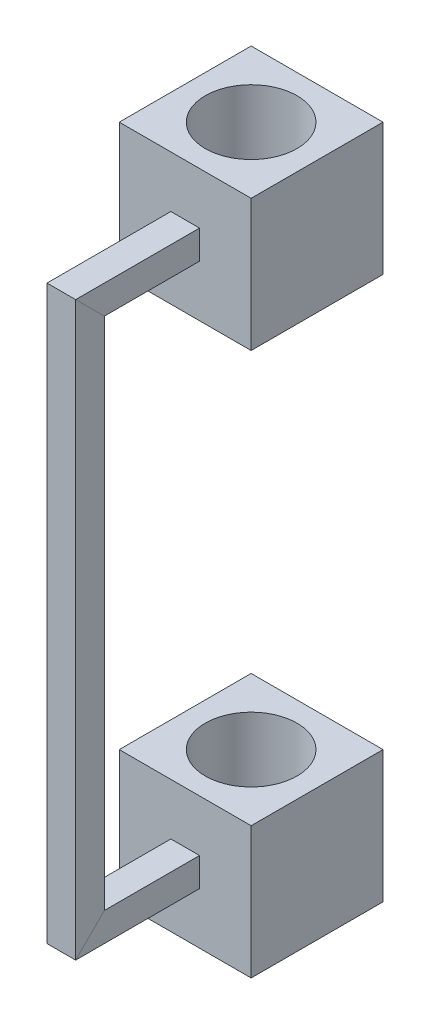
ISO-10303-21;
HEADER;
FILE_DESCRIPTION(('STEP AP214'),'2;1');
FILE_NAME('part.step','',(''),(''),'','','');
FILE_SCHEMA(('AUTOMOTIVE_DESIGN { 1 0 10303 214 1 1 1 1 }'));
ENDSEC;
DATA;
#1=APPLICATION_CONTEXT('core data for automotive mechanical design processes');
#2=APPLICATION_PROTOCOL_DEFINITION('international standard','automotive_design',2000,#1);
#3=PRODUCT_CONTEXT('',#1,'mechanical');
#4=PRODUCT('Part','Part','',(#3));
#5=PRODUCT_RELATED_PRODUCT_CATEGORY('part','',(#4));
#6=PRODUCT_DEFINITION_FORMATION('','',#4);
#7=PRODUCT_DEFINITION_CONTEXT('part definition',#1,'design');
#8=PRODUCT_DEFINITION('design','',#6,#7);
#9=PRODUCT_DEFINITION_SHAPE('','',#8);
#10=(LENGTH_UNIT() NAMED_UNIT(*) SI_UNIT(.MILLI.,.METRE.));
#11=(NAMED_UNIT(*) PLANE_ANGLE_UNIT() SI_UNIT($,.RADIAN.));
#12=(NAMED_UNIT(*) SI_UNIT($,.STERADIAN.) SOLID_ANGLE_UNIT());
#13=UNCERTAINTY_MEASURE_WITH_UNIT(LENGTH_MEASURE(1.E-05),#10,'distance_accuracy_value','');
#14=(GEOMETRIC_REPRESENTATION_CONTEXT(3) GLOBAL_UNCERTAINTY_ASSIGNED_CONTEXT((#13)) GLOBAL_UNIT_ASSIGNED_CONTEXT((#10,
#11,#12)) REPRESENTATION_CONTEXT('',''));
#15=CARTESIAN_POINT('',(0.,0.,0.));
#16=DIRECTION('',(0.,0.,1.));
#17=DIRECTION('',(1.,0.,0.));
#18=AXIS2_PLACEMENT_3D('',#15,#16,#17);
#19=CARTESIAN_POINT('',(-11.5,23.,11.5));
#20=DIRECTION('',(0.,0.,-1.));
#21=DIRECTION('',(-1.,0.,0.));
#22=AXIS2_PLACEMENT_3D('',#19,#20,#21);
#23=PLANE('',#22);
#24=DIRECTION('',(1.,0.,0.));
#25=VECTOR('',#24,1.);
#26=CARTESIAN_POINT('',(-11.5,0.,11.5));
#27=LINE('',#26,#25);
#28=CARTESIAN_POINT('',(-11.5,0.,11.5));
#29=VERTEX_POINT('',#28);
#30=CARTESIAN_POINT('',(11.5,0.,11.5));
#31=VERTEX_POINT('',#30);
#32=EDGE_CURVE('E320',#29,#31,#27,.T.);
#33=ORIENTED_EDGE('',*,*,#32,.T.);
#34=DIRECTION('',(0.,-1.,0.));
#35=VECTOR('',#34,1.);
#36=CARTESIAN_POINT('',(11.5,23.,11.5));
#37=LINE('',#36,#35);
#38=CARTESIAN_POINT('',(11.5,23.,11.5));
#39=VERTEX_POINT('',#38);
#40=EDGE_CURVE('E50',#39,#31,#37,.T.);
#41=ORIENTED_EDGE('',*,*,#40,.F.);
#42=DIRECTION('',(1.,0.,0.));
#43=VECTOR('',#42,1.);
#44=CARTESIAN_POINT('',(-11.5,23.,11.5));
#45=LINE('',#44,#43);
#46=CARTESIAN_POINT('',(-11.5,23.,11.5));
#47=VERTEX_POINT('',#46);
#48=EDGE_CURVE('E306',#47,#39,#45,.T.);
#49=ORIENTED_EDGE('',*,*,#48,.F.);
#50=DIRECTION('',(0.,-1.,0.));
#51=VECTOR('',#50,1.);
#52=CARTESIAN_POINT('',(-11.5,23.,11.5));
#53=LINE('',#52,#51);
#54=EDGE_CURVE('E12',#47,#29,#53,.T.);
#55=ORIENTED_EDGE('',*,*,#54,.T.);
#56=EDGE_LOOP('',(#33,#41,#49,#55));
#57=FACE_BOUND('',#56,.T.);
#58=DIRECTION('',(0.,-1.,0.));
#59=VECTOR('',#58,1.);
#60=CARTESIAN_POINT('',(-2.5,14.,11.5));
#61=LINE('',#60,#59);
#62=CARTESIAN_POINT('',(-2.5,14.,11.5));
#63=VERTEX_POINT('',#62);
#64=CARTESIAN_POINT('',(-2.5,9.,11.5));
#65=VERTEX_POINT('',#64);
#66=EDGE_CURVE('E57',#63,#65,#61,.T.);
#67=ORIENTED_EDGE('',*,*,#66,.F.);
#68=DIRECTION('',(-1.,0.,0.));
#69=VECTOR('',#68,1.);
#70=CARTESIAN_POINT('',(-2.5,14.,11.5));
#71=LINE('',#70,#69);
#72=CARTESIAN_POINT('',(2.5,14.,11.5));
#73=VERTEX_POINT('',#72);
#74=EDGE_CURVE('E61',#73,#63,#71,.T.);
#75=ORIENTED_EDGE('',*,*,#74,.F.);
#76=DIRECTION('',(0.,1.,0.));
#77=VECTOR('',#76,1.);
#78=CARTESIAN_POINT('',(2.5,14.,11.5));
#79=LINE('',#78,#77);
#80=CARTESIAN_POINT('',(2.5,9.,11.5));
#81=VERTEX_POINT('',#80);
#82=EDGE_CURVE('E222',#81,#73,#79,.T.);
#83=ORIENTED_EDGE('',*,*,#82,.F.);
#84=DIRECTION('',(1.,0.,0.));
#85=VECTOR('',#84,1.);
#86=CARTESIAN_POINT('',(-2.5,9.,11.5));
#87=LINE('',#86,#85);
#88=EDGE_CURVE('E208',#65,#81,#87,.T.);
#89=ORIENTED_EDGE('',*,*,#88,.F.);
#90=EDGE_LOOP('',(#67,#75,#83,#89));
#91=FACE_BOUND('',#90,.T.);
#92=ADVANCED_FACE('F41',(#57,#91),#23,.F.);
#93=CARTESIAN_POINT('',(-11.5,23.,-11.5));
#94=DIRECTION('',(1.,0.,0.));
#95=DIRECTION('',(0.,0.,-1.));
#96=AXIS2_PLACEMENT_3D('',#93,#94,#95);
#97=PLANE('',#96);
#98=DIRECTION('',(0.,0.,1.));
#99=VECTOR('',#98,1.);
#100=CARTESIAN_POINT('',(-11.5,0.,-11.5));
#101=LINE('',#100,#99);
#102=CARTESIAN_POINT('',(-11.5,0.,-11.5));
#103=VERTEX_POINT('',#102);
#104=EDGE_CURVE('E301',#103,#29,#101,.T.);
#105=ORIENTED_EDGE('',*,*,#104,.T.);
#106=ORIENTED_EDGE('',*,*,#54,.F.);
#107=DIRECTION('',(0.,0.,1.));
#108=VECTOR('',#107,1.);
#109=CARTESIAN_POINT('',(-11.5,23.,-11.5));
#110=LINE('',#109,#108);
#111=CARTESIAN_POINT('',(-11.5,23.,-11.5));
#112=VERTEX_POINT('',#111);
#113=EDGE_CURVE('E302',#112,#47,#110,.T.);
#114=ORIENTED_EDGE('',*,*,#113,.F.);
#115=DIRECTION('',(0.,-1.,0.));
#116=VECTOR('',#115,1.);
#117=CARTESIAN_POINT('',(-11.5,23.,-11.5));
#118=LINE('',#117,#116);
#119=EDGE_CURVE('E316',#112,#103,#118,.T.);
#120=ORIENTED_EDGE('',*,*,#119,.T.);
#121=EDGE_LOOP('',(#105,#106,#114,#120));
#122=FACE_BOUND('',#121,.T.);
#123=ADVANCED_FACE('F43',(#122),#97,.F.);
#124=CARTESIAN_POINT('',(11.5,23.,-11.5));
#125=DIRECTION('',(-1.,0.,0.));
#126=DIRECTION('',(0.,0.,1.));
#127=AXIS2_PLACEMENT_3D('',#124,#125,#126);
#128=PLANE('',#127);
#129=DIRECTION('',(0.,0.,-1.));
#130=VECTOR('',#129,1.);
#131=CARTESIAN_POINT('',(11.5,0.,-11.5));
#132=LINE('',#131,#130);
#133=CARTESIAN_POINT('',(11.5,0.,-11.5));
#134=VERTEX_POINT('',#133);
#135=EDGE_CURVE('E323',#31,#134,#132,.T.);
#136=ORIENTED_EDGE('',*,*,#135,.T.);
#137=DIRECTION('',(0.,-1.,0.));
#138=VECTOR('',#137,1.);
#139=CARTESIAN_POINT('',(11.5,23.,-11.5));
#140=LINE('',#139,#138);
#141=CARTESIAN_POINT('',(11.5,23.,-11.5));
#142=VERTEX_POINT('',#141);
#143=EDGE_CURVE('E331',#142,#134,#140,.T.);
#144=ORIENTED_EDGE('',*,*,#143,.F.);
#145=DIRECTION('',(0.,0.,-1.));
#146=VECTOR('',#145,1.);
#147=CARTESIAN_POINT('',(11.5,23.,-11.5));
#148=LINE('',#147,#146);
#149=EDGE_CURVE('E310',#39,#142,#148,.T.);
#150=ORIENTED_EDGE('',*,*,#149,.F.);
#151=ORIENTED_EDGE('',*,*,#40,.T.);
#152=EDGE_LOOP('',(#136,#144,#150,#151));
#153=FACE_BOUND('',#152,.T.);
#154=ADVANCED_FACE('F340',(#153),#128,.F.);
#155=CARTESIAN_POINT('',(-11.5,23.,-11.5));
#156=DIRECTION('',(0.,0.,1.));
#157=DIRECTION('',(1.,0.,0.));
#158=AXIS2_PLACEMENT_3D('',#155,#156,#157);
#159=PLANE('',#158);
#160=DIRECTION('',(-1.,0.,0.));
#161=VECTOR('',#160,1.);
#162=CARTESIAN_POINT('',(-11.5,0.,-11.5));
#163=LINE('',#162,#161);
#164=EDGE_CURVE('E307',#134,#103,#163,.T.);
#165=ORIENTED_EDGE('',*,*,#164,.T.);
#166=ORIENTED_EDGE('',*,*,#119,.F.);
#167=DIRECTION('',(-1.,0.,0.));
#168=VECTOR('',#167,1.);
#169=CARTESIAN_POINT('',(-11.5,23.,-11.5));
#170=LINE('',#169,#168);
#171=EDGE_CURVE('E313',#142,#112,#170,.T.);
#172=ORIENTED_EDGE('',*,*,#171,.F.);
#173=ORIENTED_EDGE('',*,*,#143,.T.);
#174=EDGE_LOOP('',(#165,#166,#172,#173));
#175=FACE_BOUND('',#174,.T.);
#176=ADVANCED_FACE('F349',(#175),#159,.F.);
#177=CARTESIAN_POINT('',(0.,23.,0.));
#178=DIRECTION('',(0.,1.,0.));
#179=DIRECTION('',(0.,0.,1.));
#180=AXIS2_PLACEMENT_3D('',#177,#178,#179);
#181=PLANE('',#180);
#182=CARTESIAN_POINT('',(0.,23.,0.));
#183=DIRECTION('',(0.,1.,0.));
#184=DIRECTION('',(0.,0.,1.));
#185=AXIS2_PLACEMENT_3D('',#182,#183,#184);
#186=CIRCLE('',#185,8.);
#187=CARTESIAN_POINT('',(0.,23.,8.));
#188=VERTEX_POINT('',#187);
#189=EDGE_CURVE('E297',#188,#188,#186,.T.);
#190=ORIENTED_EDGE('',*,*,#189,.F.);
#191=EDGE_LOOP('',(#190));
#192=FACE_BOUND('',#191,.T.);
#193=ORIENTED_EDGE('',*,*,#113,.T.);
#194=ORIENTED_EDGE('',*,*,#48,.T.);
#195=ORIENTED_EDGE('',*,*,#149,.T.);
#196=ORIENTED_EDGE('',*,*,#171,.T.);
#197=EDGE_LOOP('',(#193,#194,#195,#196));
#198=FACE_BOUND('',#197,.T.);
#199=ADVANCED_FACE('F355',(#192,#198),#181,.T.);
#200=CARTESIAN_POINT('',(0.,0.,0.));
#201=DIRECTION('',(0.,1.,0.));
#202=DIRECTION('',(0.,0.,1.));
#203=AXIS2_PLACEMENT_3D('',#200,#201,#202);
#204=PLANE('',#203);
#205=CARTESIAN_POINT('',(0.,0.,0.));
#206=DIRECTION('',(0.,1.,0.));
#207=DIRECTION('',(0.,0.,1.));
#208=AXIS2_PLACEMENT_3D('',#205,#206,#207);
#209=CIRCLE('',#208,8.);
#210=CARTESIAN_POINT('',(0.,0.,8.));
#211=VERTEX_POINT('',#210);
#212=EDGE_CURVE('E196',#211,#211,#209,.T.);
#213=ORIENTED_EDGE('',*,*,#212,.T.);
#214=EDGE_LOOP('',(#213));
#215=FACE_BOUND('',#214,.T.);
#216=ORIENTED_EDGE('',*,*,#104,.F.);
#217=ORIENTED_EDGE('',*,*,#164,.F.);
#218=ORIENTED_EDGE('',*,*,#135,.F.);
#219=ORIENTED_EDGE('',*,*,#32,.F.);
#220=EDGE_LOOP('',(#216,#217,#218,#219));
#221=FACE_BOUND('',#220,.T.);
#222=ADVANCED_FACE('F346',(#215,#221),#204,.F.);
#223=CARTESIAN_POINT('',(0.,23.,0.));
#224=DIRECTION('',(0.,1.,0.));
#225=DIRECTION('',(0.,0.,1.));
#226=AXIS2_PLACEMENT_3D('',#223,#224,#225);
#227=CYLINDRICAL_SURFACE('',#226,8.);
#228=ORIENTED_EDGE('',*,*,#212,.F.);
#229=EDGE_LOOP('',(#228));
#230=FACE_BOUND('',#229,.T.);
#231=ORIENTED_EDGE('',*,*,#189,.T.);
#232=EDGE_LOOP('',(#231));
#233=FACE_BOUND('',#232,.T.);
#234=ADVANCED_FACE('F367',(#230,#233),#227,.F.);
#235=CARTESIAN_POINT('',(-2.5,-85.7652131076507,33.4559208606538));
#236=DIRECTION('',(-1.,0.,0.));
#237=DIRECTION('',(0.,0.,1.));
#238=AXIS2_PLACEMENT_3D('',#235,#236,#237);
#239=PLANE('',#238);
#240=DIRECTION('',(0.,-0.707106781186548,0.707106781186548));
#241=VECTOR('',#240,1.);
#242=CARTESIAN_POINT('',(-2.5,-35.7076065538254,-16.9516856931715));
#243=LINE('',#242,#241);
#244=CARTESIAN_POINT('',(-2.5,-80.7652131076507,28.1059208606538));
#245=VERTEX_POINT('',#244);
#246=CARTESIAN_POINT('',(-2.5,-85.7652131076507,33.1059208606538));
#247=VERTEX_POINT('',#246);
#248=EDGE_CURVE('E248',#245,#247,#243,.T.);
#249=ORIENTED_EDGE('',*,*,#248,.F.);
#250=DIRECTION('',(0.,0.,-1.));
#251=VECTOR('',#250,1.);
#252=CARTESIAN_POINT('',(-2.5,-80.7652131076508,33.4559208606538));
#253=LINE('',#252,#251);
#254=CARTESIAN_POINT('',(-2.5,-80.7652131076508,11.5));
#255=VERTEX_POINT('',#254);
#256=EDGE_CURVE('E288',#245,#255,#253,.T.);
#257=ORIENTED_EDGE('',*,*,#256,.T.);
#258=DIRECTION('',(0.,1.,0.));
#259=VECTOR('',#258,1.);
#260=CARTESIAN_POINT('',(-2.5,-85.7652131076507,11.5));
#261=LINE('',#260,#259);
#262=CARTESIAN_POINT('',(-2.5,-85.7652131076507,11.5));
#263=VERTEX_POINT('',#262);
#264=EDGE_CURVE('E276',#263,#255,#261,.T.);
#265=ORIENTED_EDGE('',*,*,#264,.F.);
#266=DIRECTION('',(0.,0.,-1.));
#267=VECTOR('',#266,1.);
#268=CARTESIAN_POINT('',(-2.5,-85.7652131076507,33.4559208606538));
#269=LINE('',#268,#267);
#270=EDGE_CURVE('E254',#247,#263,#269,.T.);
#271=ORIENTED_EDGE('',*,*,#270,.F.);
#272=EDGE_LOOP('',(#249,#257,#265,#271));
#273=FACE_BOUND('',#272,.T.);
#274=ADVANCED_FACE('F374',(#273),#239,.T.);
#275=CARTESIAN_POINT('',(-2.5,-80.7652131076508,33.4559208606538));
#276=DIRECTION('',(0.,1.,0.));
#277=DIRECTION('',(0.,0.,1.));
#278=AXIS2_PLACEMENT_3D('',#275,#276,#277);
#279=PLANE('',#278);
#280=DIRECTION('',(-1.,0.,0.));
#281=VECTOR('',#280,1.);
#282=CARTESIAN_POINT('',(-2.5,-80.7652131076508,28.1059208606538));
#283=LINE('',#282,#281);
#284=CARTESIAN_POINT('',(2.5,-80.7652131076508,28.1059208606538));
#285=VERTEX_POINT('',#284);
#286=EDGE_CURVE('E209',#285,#245,#283,.T.);
#287=ORIENTED_EDGE('',*,*,#286,.F.);
#288=DIRECTION('',(0.,0.,-1.));
#289=VECTOR('',#288,1.);
#290=CARTESIAN_POINT('',(2.5,-80.7652131076508,33.4559208606538));
#291=LINE('',#290,#289);
#292=CARTESIAN_POINT('',(2.5,-80.7652131076508,11.5));
#293=VERTEX_POINT('',#292);
#294=EDGE_CURVE('E284',#285,#293,#291,.T.);
#295=ORIENTED_EDGE('',*,*,#294,.T.);
#296=DIRECTION('',(1.,0.,0.));
#297=VECTOR('',#296,1.);
#298=CARTESIAN_POINT('',(-2.5,-80.7652131076508,11.5));
#299=LINE('',#298,#297);
#300=EDGE_CURVE('E272',#255,#293,#299,.T.);
#301=ORIENTED_EDGE('',*,*,#300,.F.);
#302=ORIENTED_EDGE('',*,*,#256,.F.);
#303=EDGE_LOOP('',(#287,#295,#301,#302));
#304=FACE_BOUND('',#303,.T.);
#305=ADVANCED_FACE('F385',(#304),#279,.T.);
#306=CARTESIAN_POINT('',(2.5,-85.7652131076507,33.4559208606538));
#307=DIRECTION('',(1.,0.,0.));
#308=DIRECTION('',(0.,1.,0.));
#309=AXIS2_PLACEMENT_3D('',#306,#307,#308);
#310=PLANE('',#309);
#311=DIRECTION('',(0.,0.707106781186548,-0.707106781186548));
#312=VECTOR('',#311,1.);
#313=CARTESIAN_POINT('',(2.50000000000001,-35.7076065538254,-16.9516856931715));
#314=LINE('',#313,#312);
#315=CARTESIAN_POINT('',(2.5,-85.7652131076507,33.1059208606538));
#316=VERTEX_POINT('',#315);
#317=EDGE_CURVE('E240',#316,#285,#314,.T.);
#318=ORIENTED_EDGE('',*,*,#317,.F.);
#319=DIRECTION('',(0.,0.,-1.));
#320=VECTOR('',#319,1.);
#321=CARTESIAN_POINT('',(2.5,-85.7652131076507,33.4559208606538));
#322=LINE('',#321,#320);
#323=CARTESIAN_POINT('',(2.5,-85.7652131076507,11.5));
#324=VERTEX_POINT('',#323);
#325=EDGE_CURVE('E280',#316,#324,#322,.T.);
#326=ORIENTED_EDGE('',*,*,#325,.T.);
#327=DIRECTION('',(0.,-1.,0.));
#328=VECTOR('',#327,1.);
#329=CARTESIAN_POINT('',(2.5,-85.7652131076507,11.5));
#330=LINE('',#329,#328);
#331=EDGE_CURVE('E186',#293,#324,#330,.T.);
#332=ORIENTED_EDGE('',*,*,#331,.F.);
#333=ORIENTED_EDGE('',*,*,#294,.F.);
#334=EDGE_LOOP('',(#318,#326,#332,#333));
#335=FACE_BOUND('',#334,.T.);
#336=ADVANCED_FACE('F381',(#335),#310,.T.);
#337=CARTESIAN_POINT('',(-2.5,-85.7652131076507,33.4559208606538));
#338=DIRECTION('',(0.,-1.,0.));
#339=DIRECTION('',(0.,0.,-1.));
#340=AXIS2_PLACEMENT_3D('',#337,#338,#339);
#341=PLANE('',#340);
#342=DIRECTION('',(1.,0.,0.));
#343=VECTOR('',#342,1.);
#344=CARTESIAN_POINT('',(-2.5,-85.7652131076508,33.1059208606538));
#345=LINE('',#344,#343);
#346=EDGE_CURVE('E244',#247,#316,#345,.T.);
#347=ORIENTED_EDGE('',*,*,#346,.F.);
#348=ORIENTED_EDGE('',*,*,#270,.T.);
#349=DIRECTION('',(-1.,0.,0.));
#350=VECTOR('',#349,1.);
#351=CARTESIAN_POINT('',(-2.5,-85.7652131076507,11.5));
#352=LINE('',#351,#350);
#353=EDGE_CURVE('E181',#324,#263,#352,.T.);
#354=ORIENTED_EDGE('',*,*,#353,.F.);
#355=ORIENTED_EDGE('',*,*,#325,.F.);
#356=EDGE_LOOP('',(#347,#348,#354,#355));
#357=FACE_BOUND('',#356,.T.);
#358=ADVANCED_FACE('F377',(#357),#341,.T.);
#359=CARTESIAN_POINT('',(-2.5,14.35,33.1059208606538));
#360=DIRECTION('',(0.,0.,1.));
#361=DIRECTION('',(1.,0.,0.));
#362=AXIS2_PLACEMENT_3D('',#359,#360,#361);
#363=PLANE('',#362);
#364=DIRECTION('',(0.,-1.,0.));
#365=VECTOR('',#364,1.);
#366=CARTESIAN_POINT('',(-2.5,14.35,33.1059208606538));
#367=LINE('',#366,#365);
#368=CARTESIAN_POINT('',(-2.5,14.,33.1059208606538));
#369=VERTEX_POINT('',#368);
#370=EDGE_CURVE('E262',#369,#247,#367,.T.);
#371=ORIENTED_EDGE('',*,*,#370,.T.);
#372=ORIENTED_EDGE('',*,*,#346,.T.);
#373=DIRECTION('',(0.,-1.,0.));
#374=VECTOR('',#373,1.);
#375=CARTESIAN_POINT('',(2.5,14.35,33.1059208606538));
#376=LINE('',#375,#374);
#377=CARTESIAN_POINT('',(2.5,14.,33.1059208606538));
#378=VERTEX_POINT('',#377);
#379=EDGE_CURVE('E249',#378,#316,#376,.T.);
#380=ORIENTED_EDGE('',*,*,#379,.F.);
#381=DIRECTION('',(1.,0.,0.));
#382=VECTOR('',#381,1.);
#383=CARTESIAN_POINT('',(-2.5,14.,33.1059208606538));
#384=LINE('',#383,#382);
#385=EDGE_CURVE('E201',#369,#378,#384,.T.);
#386=ORIENTED_EDGE('',*,*,#385,.F.);
#387=EDGE_LOOP('',(#371,#372,#380,#386));
#388=FACE_BOUND('',#387,.T.);
#389=ADVANCED_FACE('F380',(#388),#363,.T.);
#390=CARTESIAN_POINT('',(2.5,14.35,33.1059208606538));
#391=DIRECTION('',(1.,0.,0.));
#392=DIRECTION('',(0.,0.,-1.));
#393=AXIS2_PLACEMENT_3D('',#390,#391,#392);
#394=PLANE('',#393);
#395=ORIENTED_EDGE('',*,*,#379,.T.);
#396=ORIENTED_EDGE('',*,*,#317,.T.);
#397=DIRECTION('',(0.,-1.,0.));
#398=VECTOR('',#397,1.);
#399=CARTESIAN_POINT('',(2.5,14.35,28.1059208606538));
#400=LINE('',#399,#398);
#401=CARTESIAN_POINT('',(2.5,9.,28.1059208606538));
#402=VERTEX_POINT('',#401);
#403=EDGE_CURVE('E253',#402,#285,#400,.T.);
#404=ORIENTED_EDGE('',*,*,#403,.F.);
#405=DIRECTION('',(0.,-0.707106781186548,-0.707106781186548));
#406=VECTOR('',#405,1.);
#407=CARTESIAN_POINT('',(2.5,3.19703956967308,22.3029604303269));
#408=LINE('',#407,#406);
#409=EDGE_CURVE('E197',#378,#402,#408,.T.);
#410=ORIENTED_EDGE('',*,*,#409,.F.);
#411=EDGE_LOOP('',(#395,#396,#404,#410));
#412=FACE_BOUND('',#411,.T.);
#413=ADVANCED_FACE('F396',(#412),#394,.T.);
#414=CARTESIAN_POINT('',(-2.5,14.35,28.1059208606538));
#415=DIRECTION('',(0.,0.,-1.));
#416=DIRECTION('',(-1.,0.,0.));
#417=AXIS2_PLACEMENT_3D('',#414,#415,#416);
#418=PLANE('',#417);
#419=ORIENTED_EDGE('',*,*,#403,.T.);
#420=ORIENTED_EDGE('',*,*,#286,.T.);
#421=DIRECTION('',(0.,-1.,0.));
#422=VECTOR('',#421,1.);
#423=CARTESIAN_POINT('',(-2.5,14.35,28.1059208606538));
#424=LINE('',#423,#422);
#425=CARTESIAN_POINT('',(-2.5,9.,28.1059208606538));
#426=VERTEX_POINT('',#425);
#427=EDGE_CURVE('E258',#426,#245,#424,.T.);
#428=ORIENTED_EDGE('',*,*,#427,.F.);
#429=DIRECTION('',(-1.,0.,0.));
#430=VECTOR('',#429,1.);
#431=CARTESIAN_POINT('',(-2.5,9.,28.1059208606538));
#432=LINE('',#431,#430);
#433=EDGE_CURVE('E192',#402,#426,#432,.T.);
#434=ORIENTED_EDGE('',*,*,#433,.F.);
#435=EDGE_LOOP('',(#419,#420,#428,#434));
#436=FACE_BOUND('',#435,.T.);
#437=ADVANCED_FACE('F400',(#436),#418,.T.);
#438=CARTESIAN_POINT('',(-2.5,14.35,33.1059208606538));
#439=DIRECTION('',(-1.,0.,0.));
#440=DIRECTION('',(0.,0.,1.));
#441=AXIS2_PLACEMENT_3D('',#438,#439,#440);
#442=PLANE('',#441);
#443=ORIENTED_EDGE('',*,*,#427,.T.);
#444=ORIENTED_EDGE('',*,*,#248,.T.);
#445=ORIENTED_EDGE('',*,*,#370,.F.);
#446=DIRECTION('',(0.,0.707106781186548,0.707106781186548));
#447=VECTOR('',#446,1.);
#448=CARTESIAN_POINT('',(-2.5,3.19703956967308,22.3029604303269));
#449=LINE('',#448,#447);
#450=EDGE_CURVE('E205',#426,#369,#449,.T.);
#451=ORIENTED_EDGE('',*,*,#450,.F.);
#452=EDGE_LOOP('',(#443,#444,#445,#451));
#453=FACE_BOUND('',#452,.T.);
#454=ADVANCED_FACE('F404',(#453),#442,.T.);
#455=CARTESIAN_POINT('',(-2.5,14.,11.5));
#456=DIRECTION('',(0.,1.,0.));
#457=DIRECTION('',(0.,0.,1.));
#458=AXIS2_PLACEMENT_3D('',#455,#456,#457);
#459=PLANE('',#458);
#460=DIRECTION('',(0.,0.,1.));
#461=VECTOR('',#460,1.);
#462=CARTESIAN_POINT('',(-2.5,14.,11.5));
#463=LINE('',#462,#461);
#464=EDGE_CURVE('E215',#63,#369,#463,.T.);
#465=ORIENTED_EDGE('',*,*,#464,.T.);
#466=ORIENTED_EDGE('',*,*,#385,.T.);
#467=DIRECTION('',(0.,0.,1.));
#468=VECTOR('',#467,1.);
#469=CARTESIAN_POINT('',(2.5,14.,11.5));
#470=LINE('',#469,#468);
#471=EDGE_CURVE('E226',#73,#378,#470,.T.);
#472=ORIENTED_EDGE('',*,*,#471,.F.);
#473=ORIENTED_EDGE('',*,*,#74,.T.);
#474=EDGE_LOOP('',(#465,#466,#472,#473));
#475=FACE_BOUND('',#474,.T.);
#476=ADVANCED_FACE('F408',(#475),#459,.T.);
#477=CARTESIAN_POINT('',(2.5,14.,11.5));
#478=DIRECTION('',(1.,0.,0.));
#479=DIRECTION('',(0.,1.,0.));
#480=AXIS2_PLACEMENT_3D('',#477,#478,#479);
#481=PLANE('',#480);
#482=ORIENTED_EDGE('',*,*,#471,.T.);
#483=ORIENTED_EDGE('',*,*,#409,.T.);
#484=DIRECTION('',(0.,0.,1.));
#485=VECTOR('',#484,1.);
#486=CARTESIAN_POINT('',(2.5,9.,11.5));
#487=LINE('',#486,#485);
#488=EDGE_CURVE('E214',#81,#402,#487,.T.);
#489=ORIENTED_EDGE('',*,*,#488,.F.);
#490=ORIENTED_EDGE('',*,*,#82,.T.);
#491=EDGE_LOOP('',(#482,#483,#489,#490));
#492=FACE_BOUND('',#491,.T.);
#493=ADVANCED_FACE('F412',(#492),#481,.T.);
#494=CARTESIAN_POINT('',(-2.5,9.,11.5));
#495=DIRECTION('',(0.,-1.,0.));
#496=DIRECTION('',(0.,0.,-1.));
#497=AXIS2_PLACEMENT_3D('',#494,#495,#496);
#498=PLANE('',#497);
#499=ORIENTED_EDGE('',*,*,#488,.T.);
#500=ORIENTED_EDGE('',*,*,#433,.T.);
#501=DIRECTION('',(0.,0.,1.));
#502=VECTOR('',#501,1.);
#503=CARTESIAN_POINT('',(-2.5,9.,11.5));
#504=LINE('',#503,#502);
#505=EDGE_CURVE('E210',#65,#426,#504,.T.);
#506=ORIENTED_EDGE('',*,*,#505,.F.);
#507=ORIENTED_EDGE('',*,*,#88,.T.);
#508=EDGE_LOOP('',(#499,#500,#506,#507));
#509=FACE_BOUND('',#508,.T.);
#510=ADVANCED_FACE('F416',(#509),#498,.T.);
#511=CARTESIAN_POINT('',(-2.5,14.,11.5));
#512=DIRECTION('',(-1.,0.,0.));
#513=DIRECTION('',(0.,0.,1.));
#514=AXIS2_PLACEMENT_3D('',#511,#512,#513);
#515=PLANE('',#514);
#516=ORIENTED_EDGE('',*,*,#505,.T.);
#517=ORIENTED_EDGE('',*,*,#450,.T.);
#518=ORIENTED_EDGE('',*,*,#464,.F.);
#519=ORIENTED_EDGE('',*,*,#66,.T.);
#520=EDGE_LOOP('',(#516,#517,#518,#519));
#521=FACE_BOUND('',#520,.T.);
#522=ADVANCED_FACE('F376',(#521),#515,.T.);
#523=CARTESIAN_POINT('',(0.,0.,11.5));
#524=DIRECTION('',(0.,0.,-1.));
#525=DIRECTION('',(0.,1.,0.));
#526=AXIS2_PLACEMENT_3D('',#523,#524,#525);
#527=PLANE('',#526);
#528=DIRECTION('',(0.,-1.,0.));
#529=VECTOR('',#528,1.);
#530=CARTESIAN_POINT('',(11.5,-71.7652131076508,11.5));
#531=LINE('',#530,#529);
#532=CARTESIAN_POINT('',(11.5,-71.7652131076508,11.5));
#533=VERTEX_POINT('',#532);
#534=CARTESIAN_POINT('',(11.5,-94.7652131076508,11.5));
#535=VERTEX_POINT('',#534);
#536=EDGE_CURVE('E179',#533,#535,#531,.T.);
#537=ORIENTED_EDGE('',*,*,#536,.F.);
#538=DIRECTION('',(1.,0.,0.));
#539=VECTOR('',#538,1.);
#540=CARTESIAN_POINT('',(11.5,-71.7652131076508,11.5));
#541=LINE('',#540,#539);
#542=CARTESIAN_POINT('',(-11.5,-71.7652131076508,11.5));
#543=VERTEX_POINT('',#542);
#544=EDGE_CURVE('E175',#543,#533,#541,.T.);
#545=ORIENTED_EDGE('',*,*,#544,.F.);
#546=DIRECTION('',(0.,1.,0.));
#547=VECTOR('',#546,1.);
#548=CARTESIAN_POINT('',(-11.5,-71.7652131076508,11.5));
#549=LINE('',#548,#547);
#550=CARTESIAN_POINT('',(-11.5,-94.7652131076508,11.5));
#551=VERTEX_POINT('',#550);
#552=EDGE_CURVE('E469',#551,#543,#549,.T.);
#553=ORIENTED_EDGE('',*,*,#552,.F.);
#554=DIRECTION('',(-1.,0.,0.));
#555=VECTOR('',#554,1.);
#556=CARTESIAN_POINT('',(11.5,-94.7652131076508,11.5));
#557=LINE('',#556,#555);
#558=EDGE_CURVE('E458',#535,#551,#557,.T.);
#559=ORIENTED_EDGE('',*,*,#558,.F.);
#560=EDGE_LOOP('',(#537,#545,#553,#559));
#561=FACE_BOUND('',#560,.T.);
#562=ORIENTED_EDGE('',*,*,#353,.T.);
#563=ORIENTED_EDGE('',*,*,#264,.T.);
#564=ORIENTED_EDGE('',*,*,#300,.T.);
#565=ORIENTED_EDGE('',*,*,#331,.T.);
#566=EDGE_LOOP('',(#562,#563,#564,#565));
#567=FACE_BOUND('',#566,.T.);
#568=ADVANCED_FACE('F393',(#561,#567),#527,.F.);
#569=CARTESIAN_POINT('',(11.5,-71.7652131076508,-11.5));
#570=DIRECTION('',(-1.,0.,0.));
#571=DIRECTION('',(0.,-1.,0.));
#572=AXIS2_PLACEMENT_3D('',#569,#570,#571);
#573=PLANE('',#572);
#574=ORIENTED_EDGE('',*,*,#536,.T.);
#575=DIRECTION('',(0.,0.,1.));
#576=VECTOR('',#575,1.);
#577=CARTESIAN_POINT('',(11.5,-94.7652131076508,-11.5));
#578=LINE('',#577,#576);
#579=CARTESIAN_POINT('',(11.5,-94.7652131076508,-11.5));
#580=VERTEX_POINT('',#579);
#581=EDGE_CURVE('E157',#580,#535,#578,.T.);
#582=ORIENTED_EDGE('',*,*,#581,.F.);
#583=DIRECTION('',(0.,-1.,0.));
#584=VECTOR('',#583,1.);
#585=CARTESIAN_POINT('',(11.5,-71.7652131076508,-11.5));
#586=LINE('',#585,#584);
#587=CARTESIAN_POINT('',(11.5,-71.7652131076508,-11.5));
#588=VERTEX_POINT('',#587);
#589=EDGE_CURVE('E165',#588,#580,#586,.T.);
#590=ORIENTED_EDGE('',*,*,#589,.F.);
#591=DIRECTION('',(0.,0.,1.));
#592=VECTOR('',#591,1.);
#593=CARTESIAN_POINT('',(11.5,-71.7652131076508,-11.5));
#594=LINE('',#593,#592);
#595=EDGE_CURVE('E465',#588,#533,#594,.T.);
#596=ORIENTED_EDGE('',*,*,#595,.T.);
#597=EDGE_LOOP('',(#574,#582,#590,#596));
#598=FACE_BOUND('',#597,.T.);
#599=ADVANCED_FACE('F177',(#598),#573,.F.);
#600=CARTESIAN_POINT('',(11.5,-94.7652131076508,-11.5));
#601=DIRECTION('',(0.,1.,0.));
#602=DIRECTION('',(0.,0.,1.));
#603=AXIS2_PLACEMENT_3D('',#600,#601,#602);
#604=PLANE('',#603);
#605=CARTESIAN_POINT('',(0.,-94.7652131076508,0.));
#606=DIRECTION('',(0.,1.,0.));
#607=DIRECTION('',(0.,0.,1.));
#608=AXIS2_PLACEMENT_3D('',#605,#606,#607);
#609=CIRCLE('',#608,8.);
#610=CARTESIAN_POINT('',(0.,-94.7652131076508,8.00000000000001));
#611=VERTEX_POINT('',#610);
#612=EDGE_CURVE('E450',#611,#611,#609,.T.);
#613=ORIENTED_EDGE('',*,*,#612,.T.);
#614=EDGE_LOOP('',(#613));
#615=FACE_BOUND('',#614,.T.);
#616=ORIENTED_EDGE('',*,*,#558,.T.);
#617=DIRECTION('',(0.,0.,1.));
#618=VECTOR('',#617,1.);
#619=CARTESIAN_POINT('',(-11.5,-94.7652131076508,-11.5));
#620=LINE('',#619,#618);
#621=CARTESIAN_POINT('',(-11.5,-94.7652131076508,-11.5));
#622=VERTEX_POINT('',#621);
#623=EDGE_CURVE('E160',#622,#551,#620,.T.);
#624=ORIENTED_EDGE('',*,*,#623,.F.);
#625=DIRECTION('',(-1.,0.,0.));
#626=VECTOR('',#625,1.);
#627=CARTESIAN_POINT('',(11.5,-94.7652131076508,-11.5));
#628=LINE('',#627,#626);
#629=EDGE_CURVE('E153',#580,#622,#628,.T.);
#630=ORIENTED_EDGE('',*,*,#629,.F.);
#631=ORIENTED_EDGE('',*,*,#581,.T.);
#632=EDGE_LOOP('',(#616,#624,#630,#631));
#633=FACE_BOUND('',#632,.T.);
#634=ADVANCED_FACE('F155',(#615,#633),#604,.F.);
#635=CARTESIAN_POINT('',(-11.5,-71.7652131076508,-11.5));
#636=DIRECTION('',(1.,0.,0.));
#637=DIRECTION('',(0.,1.,0.));
#638=AXIS2_PLACEMENT_3D('',#635,#636,#637);
#639=PLANE('',#638);
#640=ORIENTED_EDGE('',*,*,#552,.T.);
#641=DIRECTION('',(0.,0.,1.));
#642=VECTOR('',#641,1.);
#643=CARTESIAN_POINT('',(-11.5,-71.7652131076508,-11.5));
#644=LINE('',#643,#642);
#645=CARTESIAN_POINT('',(-11.5,-71.7652131076508,-11.5));
#646=VERTEX_POINT('',#645);
#647=EDGE_CURVE('E188',#646,#543,#644,.T.);
#648=ORIENTED_EDGE('',*,*,#647,.F.);
#649=DIRECTION('',(0.,1.,0.));
#650=VECTOR('',#649,1.);
#651=CARTESIAN_POINT('',(-11.5,-71.7652131076508,-11.5));
#652=LINE('',#651,#650);
#653=EDGE_CURVE('E164',#622,#646,#652,.T.);
#654=ORIENTED_EDGE('',*,*,#653,.F.);
#655=ORIENTED_EDGE('',*,*,#623,.T.);
#656=EDGE_LOOP('',(#640,#648,#654,#655));
#657=FACE_BOUND('',#656,.T.);
#658=ADVANCED_FACE('F428',(#657),#639,.F.);
#659=CARTESIAN_POINT('',(11.5,-71.7652131076508,-11.5));
#660=DIRECTION('',(0.,-1.,0.));
#661=DIRECTION('',(0.,0.,-1.));
#662=AXIS2_PLACEMENT_3D('',#659,#660,#661);
#663=PLANE('',#662);
#664=CARTESIAN_POINT('',(0.,-71.7652131076508,0.));
#665=DIRECTION('',(0.,1.,0.));
#666=DIRECTION('',(0.,0.,1.));
#667=AXIS2_PLACEMENT_3D('',#664,#665,#666);
#668=CIRCLE('',#667,8.);
#669=CARTESIAN_POINT('',(0.,-71.7652131076508,8.00000000000001));
#670=VERTEX_POINT('',#669);
#671=EDGE_CURVE('E453',#670,#670,#668,.T.);
#672=ORIENTED_EDGE('',*,*,#671,.F.);
#673=EDGE_LOOP('',(#672));
#674=FACE_BOUND('',#673,.T.);
#675=ORIENTED_EDGE('',*,*,#544,.T.);
#676=ORIENTED_EDGE('',*,*,#595,.F.);
#677=DIRECTION('',(1.,0.,0.));
#678=VECTOR('',#677,1.);
#679=CARTESIAN_POINT('',(11.5,-71.7652131076508,-11.5));
#680=LINE('',#679,#678);
#681=EDGE_CURVE('E170',#646,#588,#680,.T.);
#682=ORIENTED_EDGE('',*,*,#681,.F.);
#683=ORIENTED_EDGE('',*,*,#647,.T.);
#684=EDGE_LOOP('',(#675,#676,#682,#683));
#685=FACE_BOUND('',#684,.T.);
#686=ADVANCED_FACE('F432',(#674,#685),#663,.F.);
#687=CARTESIAN_POINT('',(0.,0.,-11.5));
#688=DIRECTION('',(0.,0.,-1.));
#689=DIRECTION('',(0.,1.,0.));
#690=AXIS2_PLACEMENT_3D('',#687,#688,#689);
#691=PLANE('',#690);
#692=ORIENTED_EDGE('',*,*,#589,.T.);
#693=ORIENTED_EDGE('',*,*,#629,.T.);
#694=ORIENTED_EDGE('',*,*,#653,.T.);
#695=ORIENTED_EDGE('',*,*,#681,.T.);
#696=EDGE_LOOP('',(#692,#693,#694,#695));
#697=FACE_BOUND('',#696,.T.);
#698=ADVANCED_FACE('F168',(#697),#691,.T.);
#699=CARTESIAN_POINT('',(0.,-71.7652131076508,0.));
#700=DIRECTION('',(0.,1.,0.));
#701=DIRECTION('',(0.,0.,1.));
#702=AXIS2_PLACEMENT_3D('',#699,#700,#701);
#703=CYLINDRICAL_SURFACE('',#702,8.);
#704=ORIENTED_EDGE('',*,*,#612,.F.);
#705=EDGE_LOOP('',(#704));
#706=FACE_BOUND('',#705,.T.);
#707=ORIENTED_EDGE('',*,*,#671,.T.);
#708=EDGE_LOOP('',(#707));
#709=FACE_BOUND('',#708,.T.);
#710=ADVANCED_FACE('F442',(#706,#709),#703,.F.);
#711=CLOSED_SHELL('',(#92,#123,#154,#176,#199,#222,#234,#274,#305,#336,#358,#389,#413,#437,#454,
#476,#493,#510,#522,#568,#599,#634,#658,#686,#698,#710));
#712=MANIFOLD_SOLID_BREP('B2',#711);
#713=ADVANCED_BREP_SHAPE_REPRESENTATION('',(#18,#712),#14);
#714=SHAPE_DEFINITION_REPRESENTATION(#9,#713);
ENDSEC;
END-ISO-10303-21;
